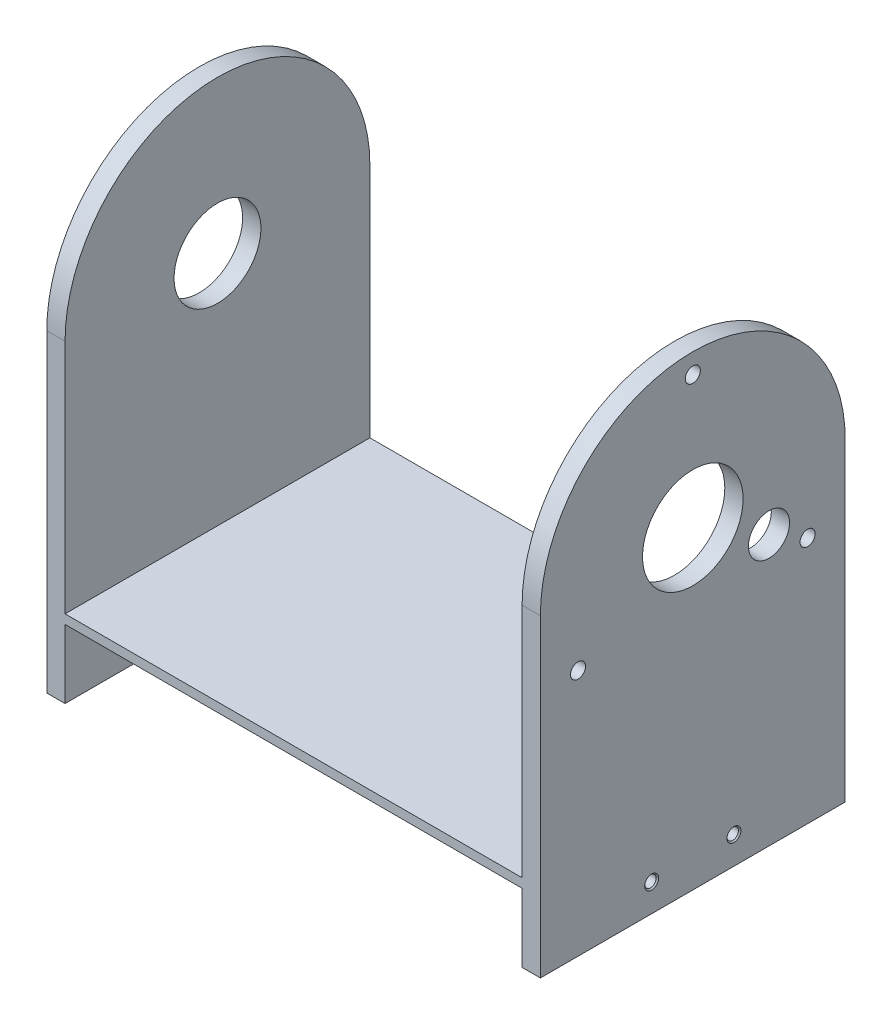
ISO-10303-21;
HEADER;
FILE_DESCRIPTION(('STEP AP214'),'2;1');
FILE_NAME('part.step','',(''),(''),'','','');
FILE_SCHEMA(('AUTOMOTIVE_DESIGN { 1 0 10303 214 1 1 1 1 }'));
ENDSEC;
DATA;
#1=APPLICATION_CONTEXT('core data for automotive mechanical design processes');
#2=APPLICATION_PROTOCOL_DEFINITION('international standard','automotive_design',2000,#1);
#3=PRODUCT_CONTEXT('',#1,'mechanical');
#4=PRODUCT('Part','Part','',(#3));
#5=PRODUCT_RELATED_PRODUCT_CATEGORY('part','',(#4));
#6=PRODUCT_DEFINITION_FORMATION('','',#4);
#7=PRODUCT_DEFINITION_CONTEXT('part definition',#1,'design');
#8=PRODUCT_DEFINITION('design','',#6,#7);
#9=PRODUCT_DEFINITION_SHAPE('','',#8);
#10=(LENGTH_UNIT() NAMED_UNIT(*) SI_UNIT(.MILLI.,.METRE.));
#11=(NAMED_UNIT(*) PLANE_ANGLE_UNIT() SI_UNIT($,.RADIAN.));
#12=(NAMED_UNIT(*) SI_UNIT($,.STERADIAN.) SOLID_ANGLE_UNIT());
#13=UNCERTAINTY_MEASURE_WITH_UNIT(LENGTH_MEASURE(1.E-05),#10,'distance_accuracy_value','');
#14=(GEOMETRIC_REPRESENTATION_CONTEXT(3) GLOBAL_UNCERTAINTY_ASSIGNED_CONTEXT((#13)) GLOBAL_UNIT_ASSIGNED_CONTEXT((#10,
#11,#12)) REPRESENTATION_CONTEXT('',''));
#15=CARTESIAN_POINT('',(0.,0.,0.));
#16=DIRECTION('',(0.,0.,1.));
#17=DIRECTION('',(1.,0.,0.));
#18=AXIS2_PLACEMENT_3D('',#15,#16,#17);
#19=CARTESIAN_POINT('',(-120.,102.,-33.35));
#20=DIRECTION('',(-1.,0.,0.));
#21=DIRECTION('',(0.,0.,1.));
#22=AXIS2_PLACEMENT_3D('',#19,#20,#21);
#23=PLANE('',#22);
#24=CARTESIAN_POINT('',(-120.,68.65,0.));
#25=DIRECTION('',(-1.,0.,0.));
#26=DIRECTION('',(0.,0.,1.));
#27=AXIS2_PLACEMENT_3D('',#24,#25,#26);
#28=CIRCLE('',#27,9.5);
#29=CARTESIAN_POINT('',(-120.,68.65,9.5));
#30=VERTEX_POINT('',#29);
#31=EDGE_CURVE('E251',#30,#30,#28,.F.);
#32=ORIENTED_EDGE('',*,*,#31,.F.);
#33=EDGE_LOOP('',(#32));
#34=FACE_BOUND('',#33,.T.);
#35=CARTESIAN_POINT('',(-120.,68.65,0.));
#36=DIRECTION('',(-1.,0.,0.));
#37=DIRECTION('',(0.,0.,1.));
#38=AXIS2_PLACEMENT_3D('',#35,#36,#37);
#39=CIRCLE('',#38,33.35);
#40=CARTESIAN_POINT('',(-120.,68.65,33.35));
#41=VERTEX_POINT('',#40);
#42=CARTESIAN_POINT('',(-120.,68.65,-33.35));
#43=VERTEX_POINT('',#42);
#44=EDGE_CURVE('E263',#41,#43,#39,.T.);
#45=ORIENTED_EDGE('',*,*,#44,.F.);
#46=DIRECTION('',(0.,-1.,0.));
#47=VECTOR('',#46,1.);
#48=CARTESIAN_POINT('',(-120.,102.,33.35));
#49=LINE('',#48,#47);
#50=CARTESIAN_POINT('',(-120.,17.,33.35));
#51=VERTEX_POINT('',#50);
#52=EDGE_CURVE('E274',#41,#51,#49,.T.);
#53=ORIENTED_EDGE('',*,*,#52,.T.);
#54=DIRECTION('',(0.,0.,1.));
#55=VECTOR('',#54,1.);
#56=CARTESIAN_POINT('',(-120.,17.,-33.35));
#57=LINE('',#56,#55);
#58=CARTESIAN_POINT('',(-120.,17.,-33.35));
#59=VERTEX_POINT('',#58);
#60=EDGE_CURVE('E285',#59,#51,#57,.T.);
#61=ORIENTED_EDGE('',*,*,#60,.F.);
#62=DIRECTION('',(0.,-1.,0.));
#63=VECTOR('',#62,1.);
#64=CARTESIAN_POINT('',(-120.,102.,-33.35));
#65=LINE('',#64,#63);
#66=EDGE_CURVE('E280',#43,#59,#65,.T.);
#67=ORIENTED_EDGE('',*,*,#66,.F.);
#68=EDGE_LOOP('',(#45,#53,#61,#67));
#69=FACE_BOUND('',#68,.T.);
#70=ADVANCED_FACE('F77',(#34,#69),#23,.F.);
#71=CARTESIAN_POINT('',(-124.,102.,-33.35));
#72=DIRECTION('',(1.,0.,0.));
#73=DIRECTION('',(0.,0.,-1.));
#74=AXIS2_PLACEMENT_3D('',#71,#72,#73);
#75=PLANE('',#74);
#76=CARTESIAN_POINT('',(-124.,6.,9.00000000000001));
#77=DIRECTION('',(1.,0.,0.));
#78=DIRECTION('',(0.,0.,-1.));
#79=AXIS2_PLACEMENT_3D('',#76,#77,#78);
#80=CIRCLE('',#79,1.24999999999999);
#81=CARTESIAN_POINT('',(-124.,6.,7.75000000000002));
#82=VERTEX_POINT('',#81);
#83=EDGE_CURVE('E390',#82,#82,#80,.T.);
#84=ORIENTED_EDGE('',*,*,#83,.T.);
#85=EDGE_LOOP('',(#84));
#86=FACE_BOUND('',#85,.T.);
#87=CARTESIAN_POINT('',(-124.,6.,-8.99999999999999));
#88=DIRECTION('',(1.,0.,0.));
#89=DIRECTION('',(0.,0.,-1.));
#90=AXIS2_PLACEMENT_3D('',#87,#88,#89);
#91=CIRCLE('',#90,1.24999999999999);
#92=CARTESIAN_POINT('',(-124.,6.,-10.25));
#93=VERTEX_POINT('',#92);
#94=EDGE_CURVE('E222',#93,#93,#91,.T.);
#95=ORIENTED_EDGE('',*,*,#94,.T.);
#96=EDGE_LOOP('',(#95));
#97=FACE_BOUND('',#96,.T.);
#98=CARTESIAN_POINT('',(-124.,68.65,0.));
#99=DIRECTION('',(-1.,0.,0.));
#100=DIRECTION('',(0.,0.,1.));
#101=AXIS2_PLACEMENT_3D('',#98,#99,#100);
#102=CIRCLE('',#101,9.5);
#103=CARTESIAN_POINT('',(-124.,68.65,9.5));
#104=VERTEX_POINT('',#103);
#105=EDGE_CURVE('E250',#104,#104,#102,.T.);
#106=ORIENTED_EDGE('',*,*,#105,.F.);
#107=EDGE_LOOP('',(#106));
#108=FACE_BOUND('',#107,.T.);
#109=DIRECTION('',(0.,-1.,0.));
#110=VECTOR('',#109,1.);
#111=CARTESIAN_POINT('',(-124.,102.,33.35));
#112=LINE('',#111,#110);
#113=CARTESIAN_POINT('',(-124.,68.65,33.35));
#114=VERTEX_POINT('',#113);
#115=CARTESIAN_POINT('',(-124.,0.,33.35));
#116=VERTEX_POINT('',#115);
#117=EDGE_CURVE('E276',#114,#116,#112,.T.);
#118=ORIENTED_EDGE('',*,*,#117,.F.);
#119=CARTESIAN_POINT('',(-124.,68.65,0.));
#120=DIRECTION('',(1.,0.,0.));
#121=DIRECTION('',(0.,0.,-1.));
#122=AXIS2_PLACEMENT_3D('',#119,#120,#121);
#123=CIRCLE('',#122,33.35);
#124=CARTESIAN_POINT('',(-124.,68.65,-33.35));
#125=VERTEX_POINT('',#124);
#126=EDGE_CURVE('E261',#125,#114,#123,.T.);
#127=ORIENTED_EDGE('',*,*,#126,.F.);
#128=DIRECTION('',(0.,-1.,0.));
#129=VECTOR('',#128,1.);
#130=CARTESIAN_POINT('',(-124.,102.,-33.35));
#131=LINE('',#130,#129);
#132=CARTESIAN_POINT('',(-124.,0.,-33.35));
#133=VERTEX_POINT('',#132);
#134=EDGE_CURVE('E102',#125,#133,#131,.T.);
#135=ORIENTED_EDGE('',*,*,#134,.T.);
#136=DIRECTION('',(0.,0.,-1.));
#137=VECTOR('',#136,1.);
#138=CARTESIAN_POINT('',(-124.,0.,33.35));
#139=LINE('',#138,#137);
#140=EDGE_CURVE('E186',#116,#133,#139,.T.);
#141=ORIENTED_EDGE('',*,*,#140,.F.);
#142=EDGE_LOOP('',(#118,#127,#135,#141));
#143=FACE_BOUND('',#142,.T.);
#144=ADVANCED_FACE('F355',(#86,#97,#108,#143),#75,.F.);
#145=CARTESIAN_POINT('',(-20.,2.,-33.35));
#146=DIRECTION('',(0.,0.,1.));
#147=DIRECTION('',(1.,0.,0.));
#148=AXIS2_PLACEMENT_3D('',#145,#146,#147);
#149=PLANE('',#148);
#150=DIRECTION('',(0.,-1.,0.));
#151=VECTOR('',#150,1.);
#152=CARTESIAN_POINT('',(-16.,102.,-33.35));
#153=LINE('',#152,#151);
#154=CARTESIAN_POINT('',(-16.,68.65,-33.35));
#155=VERTEX_POINT('',#154);
#156=CARTESIAN_POINT('',(-16.,0.,-33.35));
#157=VERTEX_POINT('',#156);
#158=EDGE_CURVE('E171',#155,#157,#153,.T.);
#159=ORIENTED_EDGE('',*,*,#158,.T.);
#160=DIRECTION('',(-1.,0.,0.));
#161=VECTOR('',#160,1.);
#162=CARTESIAN_POINT('',(-20.,0.,-33.35));
#163=LINE('',#162,#161);
#164=CARTESIAN_POINT('',(-20.,0.,-33.35));
#165=VERTEX_POINT('',#164);
#166=EDGE_CURVE('E174',#157,#165,#163,.T.);
#167=ORIENTED_EDGE('',*,*,#166,.T.);
#168=DIRECTION('',(0.,-1.,0.));
#169=VECTOR('',#168,1.);
#170=CARTESIAN_POINT('',(-20.,2.,-33.35));
#171=LINE('',#170,#169);
#172=CARTESIAN_POINT('',(-20.,15.,-33.35));
#173=VERTEX_POINT('',#172);
#174=EDGE_CURVE('E203',#173,#165,#171,.T.);
#175=ORIENTED_EDGE('',*,*,#174,.F.);
#176=DIRECTION('',(1.,0.,0.));
#177=VECTOR('',#176,1.);
#178=CARTESIAN_POINT('',(-120.,15.,-33.35));
#179=LINE('',#178,#177);
#180=CARTESIAN_POINT('',(-120.,15.,-33.35));
#181=VERTEX_POINT('',#180);
#182=EDGE_CURVE('E301',#181,#173,#179,.T.);
#183=ORIENTED_EDGE('',*,*,#182,.F.);
#184=CARTESIAN_POINT('',(-120.,0.,-33.35));
#185=VERTEX_POINT('',#184);
#186=EDGE_CURVE('E279',#181,#185,#65,.T.);
#187=ORIENTED_EDGE('',*,*,#186,.T.);
#188=DIRECTION('',(-1.,0.,0.));
#189=VECTOR('',#188,1.);
#190=CARTESIAN_POINT('',(-120.,0.,-33.35));
#191=LINE('',#190,#189);
#192=EDGE_CURVE('E268',#185,#133,#191,.T.);
#193=ORIENTED_EDGE('',*,*,#192,.T.);
#194=ORIENTED_EDGE('',*,*,#134,.F.);
#195=DIRECTION('',(-1.,0.,0.));
#196=VECTOR('',#195,1.);
#197=CARTESIAN_POINT('',(20.,68.65,-33.35));
#198=LINE('',#197,#196);
#199=EDGE_CURVE('E259',#43,#125,#198,.T.);
#200=ORIENTED_EDGE('',*,*,#199,.F.);
#201=ORIENTED_EDGE('',*,*,#66,.T.);
#202=DIRECTION('',(1.,0.,0.));
#203=VECTOR('',#202,1.);
#204=CARTESIAN_POINT('',(-120.,17.,-33.35));
#205=LINE('',#204,#203);
#206=CARTESIAN_POINT('',(-20.,17.,-33.35));
#207=VERTEX_POINT('',#206);
#208=EDGE_CURVE('E289',#59,#207,#205,.T.);
#209=ORIENTED_EDGE('',*,*,#208,.T.);
#210=CARTESIAN_POINT('',(-20.,68.65,-33.35));
#211=VERTEX_POINT('',#210);
#212=EDGE_CURVE('E86',#211,#207,#171,.T.);
#213=ORIENTED_EDGE('',*,*,#212,.F.);
#214=DIRECTION('',(-1.,0.,0.));
#215=VECTOR('',#214,1.);
#216=CARTESIAN_POINT('',(20.,68.65,-33.35));
#217=LINE('',#216,#215);
#218=EDGE_CURVE('E178',#155,#211,#217,.T.);
#219=ORIENTED_EDGE('',*,*,#218,.F.);
#220=EDGE_LOOP('',(#159,#167,#175,#183,#187,#193,#194,#200,#201,#209,#213,#219));
#221=FACE_BOUND('',#220,.T.);
#222=ADVANCED_FACE('F79',(#221),#149,.F.);
#223=CARTESIAN_POINT('',(-20.,2.,33.35));
#224=DIRECTION('',(1.,0.,0.));
#225=DIRECTION('',(0.,0.,-1.));
#226=AXIS2_PLACEMENT_3D('',#223,#224,#225);
#227=PLANE('',#226);
#228=CARTESIAN_POINT('',(-20.,6.,9.));
#229=DIRECTION('',(1.,0.,0.));
#230=DIRECTION('',(0.,0.,-1.));
#231=AXIS2_PLACEMENT_3D('',#228,#229,#230);
#232=CIRCLE('',#231,1.24999999999999);
#233=CARTESIAN_POINT('',(-20.,6.,7.75000000000001));
#234=VERTEX_POINT('',#233);
#235=EDGE_CURVE('E389',#234,#234,#232,.T.);
#236=ORIENTED_EDGE('',*,*,#235,.T.);
#237=EDGE_LOOP('',(#236));
#238=FACE_BOUND('',#237,.T.);
#239=CARTESIAN_POINT('',(-20.,6.,-9.));
#240=DIRECTION('',(1.,0.,0.));
#241=DIRECTION('',(0.,0.,-1.));
#242=AXIS2_PLACEMENT_3D('',#239,#240,#241);
#243=CIRCLE('',#242,1.24999999999999);
#244=CARTESIAN_POINT('',(-20.,6.,-10.25));
#245=VERTEX_POINT('',#244);
#246=EDGE_CURVE('E187',#245,#245,#243,.T.);
#247=ORIENTED_EDGE('',*,*,#246,.T.);
#248=EDGE_LOOP('',(#247));
#249=FACE_BOUND('',#248,.T.);
#250=DIRECTION('',(0.,0.,1.));
#251=VECTOR('',#250,1.);
#252=CARTESIAN_POINT('',(-20.,15.,-33.35));
#253=LINE('',#252,#251);
#254=CARTESIAN_POINT('',(-20.,15.,33.35));
#255=VERTEX_POINT('',#254);
#256=EDGE_CURVE('E282',#173,#255,#253,.T.);
#257=ORIENTED_EDGE('',*,*,#256,.F.);
#258=ORIENTED_EDGE('',*,*,#174,.T.);
#259=DIRECTION('',(0.,0.,1.));
#260=VECTOR('',#259,1.);
#261=CARTESIAN_POINT('',(-20.,0.,33.35));
#262=LINE('',#261,#260);
#263=CARTESIAN_POINT('',(-20.,0.,33.35));
#264=VERTEX_POINT('',#263);
#265=EDGE_CURVE('E192',#165,#264,#262,.T.);
#266=ORIENTED_EDGE('',*,*,#265,.T.);
#267=DIRECTION('',(0.,-1.,0.));
#268=VECTOR('',#267,1.);
#269=CARTESIAN_POINT('',(-20.,2.,33.35));
#270=LINE('',#269,#268);
#271=EDGE_CURVE('E199',#255,#264,#270,.T.);
#272=ORIENTED_EDGE('',*,*,#271,.F.);
#273=EDGE_LOOP('',(#257,#258,#266,#272));
#274=FACE_BOUND('',#273,.T.);
#275=ADVANCED_FACE('F327',(#238,#249,#274),#227,.F.);
#276=CARTESIAN_POINT('',(-20.,59.0250000000002,-16.6709890228505));
#277=DIRECTION('',(1.,0.,0.));
#278=DIRECTION('',(0.,0.,-1.));
#279=AXIS2_PLACEMENT_3D('',#276,#277,#278);
#280=CIRCLE('',#279,4.49999999999999);
#281=CARTESIAN_POINT('',(-20.,59.0250000000002,-21.1709890228505));
#282=VERTEX_POINT('',#281);
#283=EDGE_CURVE('E238',#282,#282,#280,.F.);
#284=ORIENTED_EDGE('',*,*,#283,.F.);
#285=EDGE_LOOP('',(#284));
#286=FACE_BOUND('',#285,.T.);
#287=CARTESIAN_POINT('',(-20.,68.65,0.));
#288=DIRECTION('',(1.,0.,0.));
#289=DIRECTION('',(0.,0.,-1.));
#290=AXIS2_PLACEMENT_3D('',#287,#288,#289);
#291=CIRCLE('',#290,11.);
#292=CARTESIAN_POINT('',(-20.,68.65,-11.));
#293=VERTEX_POINT('',#292);
#294=EDGE_CURVE('E247',#293,#293,#291,.F.);
#295=ORIENTED_EDGE('',*,*,#294,.F.);
#296=EDGE_LOOP('',(#295));
#297=FACE_BOUND('',#296,.T.);
#298=CARTESIAN_POINT('',(-20.,97.65,0.));
#299=DIRECTION('',(-1.,0.,0.));
#300=DIRECTION('',(0.,0.,1.));
#301=AXIS2_PLACEMENT_3D('',#298,#299,#300);
#302=CIRCLE('',#301,2.025);
#303=CARTESIAN_POINT('',(-20.,97.65,2.025));
#304=VERTEX_POINT('',#303);
#305=EDGE_CURVE('E304',#304,#304,#302,.T.);
#306=ORIENTED_EDGE('',*,*,#305,.F.);
#307=EDGE_LOOP('',(#306));
#308=FACE_BOUND('',#307,.T.);
#309=CARTESIAN_POINT('',(-20.,54.1499999999999,25.1147367097487));
#310=DIRECTION('',(-1.,0.,0.));
#311=DIRECTION('',(0.,0.,1.));
#312=AXIS2_PLACEMENT_3D('',#309,#310,#311);
#313=CIRCLE('',#312,2.025);
#314=CARTESIAN_POINT('',(-20.,54.1499999999999,27.1397367097487));
#315=VERTEX_POINT('',#314);
#316=EDGE_CURVE('E218',#315,#315,#313,.T.);
#317=ORIENTED_EDGE('',*,*,#316,.F.);
#318=EDGE_LOOP('',(#317));
#319=FACE_BOUND('',#318,.T.);
#320=CARTESIAN_POINT('',(-20.,54.1500000000002,-25.1147367097489));
#321=DIRECTION('',(-1.,0.,0.));
#322=DIRECTION('',(0.,0.,1.));
#323=AXIS2_PLACEMENT_3D('',#320,#321,#322);
#324=CIRCLE('',#323,2.025);
#325=CARTESIAN_POINT('',(-20.,54.1500000000002,-23.0897367097489));
#326=VERTEX_POINT('',#325);
#327=EDGE_CURVE('E214',#326,#326,#324,.T.);
#328=ORIENTED_EDGE('',*,*,#327,.F.);
#329=EDGE_LOOP('',(#328));
#330=FACE_BOUND('',#329,.T.);
#331=ORIENTED_EDGE('',*,*,#212,.T.);
#332=DIRECTION('',(0.,0.,1.));
#333=VECTOR('',#332,1.);
#334=CARTESIAN_POINT('',(-20.,17.,-33.35));
#335=LINE('',#334,#333);
#336=CARTESIAN_POINT('',(-20.,17.,33.35));
#337=VERTEX_POINT('',#336);
#338=EDGE_CURVE('E286',#207,#337,#335,.T.);
#339=ORIENTED_EDGE('',*,*,#338,.T.);
#340=CARTESIAN_POINT('',(-20.,68.65,33.35));
#341=VERTEX_POINT('',#340);
#342=EDGE_CURVE('E200',#341,#337,#270,.T.);
#343=ORIENTED_EDGE('',*,*,#342,.F.);
#344=CARTESIAN_POINT('',(-20.,68.65,0.));
#345=DIRECTION('',(-1.,0.,0.));
#346=DIRECTION('',(0.,0.,1.));
#347=AXIS2_PLACEMENT_3D('',#344,#345,#346);
#348=CIRCLE('',#347,33.35);
#349=EDGE_CURVE('E179',#341,#211,#348,.T.);
#350=ORIENTED_EDGE('',*,*,#349,.T.);
#351=EDGE_LOOP('',(#331,#339,#343,#350));
#352=FACE_BOUND('',#351,.T.);
#353=ADVANCED_FACE('F354',(#286,#297,#308,#319,#330,#352),#227,.F.);
#354=CARTESIAN_POINT('',(-16.,102.,-33.35));
#355=DIRECTION('',(-1.,0.,0.));
#356=DIRECTION('',(0.,0.,1.));
#357=AXIS2_PLACEMENT_3D('',#354,#355,#356);
#358=PLANE('',#357);
#359=CARTESIAN_POINT('',(-16.,6.,9.));
#360=DIRECTION('',(1.,0.,0.));
#361=DIRECTION('',(0.,0.,-1.));
#362=AXIS2_PLACEMENT_3D('',#359,#360,#361);
#363=CIRCLE('',#362,1.525);
#364=CARTESIAN_POINT('',(-16.,6.,7.475));
#365=VERTEX_POINT('',#364);
#366=EDGE_CURVE('E398',#365,#365,#363,.T.);
#367=ORIENTED_EDGE('',*,*,#366,.F.);
#368=EDGE_LOOP('',(#367));
#369=FACE_BOUND('',#368,.T.);
#370=CARTESIAN_POINT('',(-16.,6.,-9.));
#371=DIRECTION('',(1.,0.,0.));
#372=DIRECTION('',(0.,0.,-1.));
#373=AXIS2_PLACEMENT_3D('',#370,#371,#372);
#374=CIRCLE('',#373,1.525);
#375=CARTESIAN_POINT('',(-16.,6.,-10.525));
#376=VERTEX_POINT('',#375);
#377=EDGE_CURVE('E233',#376,#376,#374,.T.);
#378=ORIENTED_EDGE('',*,*,#377,.F.);
#379=EDGE_LOOP('',(#378));
#380=FACE_BOUND('',#379,.T.);
#381=CARTESIAN_POINT('',(-16.,59.0250000000002,-16.6709890228505));
#382=DIRECTION('',(1.,0.,0.));
#383=DIRECTION('',(0.,0.,-1.));
#384=AXIS2_PLACEMENT_3D('',#381,#382,#383);
#385=CIRCLE('',#384,4.49999999999999);
#386=CARTESIAN_POINT('',(-16.,59.0250000000002,-21.1709890228505));
#387=VERTEX_POINT('',#386);
#388=EDGE_CURVE('E241',#387,#387,#385,.T.);
#389=ORIENTED_EDGE('',*,*,#388,.F.);
#390=EDGE_LOOP('',(#389));
#391=FACE_BOUND('',#390,.T.);
#392=CARTESIAN_POINT('',(-16.,68.65,0.));
#393=DIRECTION('',(1.,0.,0.));
#394=DIRECTION('',(0.,0.,-1.));
#395=AXIS2_PLACEMENT_3D('',#392,#393,#394);
#396=CIRCLE('',#395,11.);
#397=CARTESIAN_POINT('',(-16.,68.65,-11.));
#398=VERTEX_POINT('',#397);
#399=EDGE_CURVE('E244',#398,#398,#396,.T.);
#400=ORIENTED_EDGE('',*,*,#399,.F.);
#401=EDGE_LOOP('',(#400));
#402=FACE_BOUND('',#401,.T.);
#403=CARTESIAN_POINT('',(-16.,97.65,0.));
#404=DIRECTION('',(-1.,0.,0.));
#405=DIRECTION('',(0.,0.,1.));
#406=AXIS2_PLACEMENT_3D('',#403,#404,#405);
#407=CIRCLE('',#406,1.64999999999998);
#408=CARTESIAN_POINT('',(-16.,97.65,1.64999999999998));
#409=VERTEX_POINT('',#408);
#410=EDGE_CURVE('E216',#409,#409,#407,.T.);
#411=ORIENTED_EDGE('',*,*,#410,.T.);
#412=EDGE_LOOP('',(#411));
#413=FACE_BOUND('',#412,.T.);
#414=CARTESIAN_POINT('',(-16.,54.1499999999999,25.1147367097487));
#415=DIRECTION('',(-1.,0.,0.));
#416=DIRECTION('',(0.,0.,1.));
#417=AXIS2_PLACEMENT_3D('',#414,#415,#416);
#418=CIRCLE('',#417,1.64999999999999);
#419=CARTESIAN_POINT('',(-16.,54.1499999999999,26.7647367097487));
#420=VERTEX_POINT('',#419);
#421=EDGE_CURVE('E211',#420,#420,#418,.T.);
#422=ORIENTED_EDGE('',*,*,#421,.T.);
#423=EDGE_LOOP('',(#422));
#424=FACE_BOUND('',#423,.T.);
#425=CARTESIAN_POINT('',(-16.,54.1500000000002,-25.1147367097489));
#426=DIRECTION('',(-1.,0.,0.));
#427=DIRECTION('',(0.,0.,1.));
#428=AXIS2_PLACEMENT_3D('',#425,#426,#427);
#429=CIRCLE('',#428,1.64999999999999);
#430=CARTESIAN_POINT('',(-16.,54.1500000000002,-23.4647367097489));
#431=VERTEX_POINT('',#430);
#432=EDGE_CURVE('E207',#431,#431,#429,.T.);
#433=ORIENTED_EDGE('',*,*,#432,.T.);
#434=EDGE_LOOP('',(#433));
#435=FACE_BOUND('',#434,.T.);
#436=CARTESIAN_POINT('',(-16.,68.65,0.));
#437=DIRECTION('',(-1.,0.,0.));
#438=DIRECTION('',(0.,0.,1.));
#439=AXIS2_PLACEMENT_3D('',#436,#437,#438);
#440=CIRCLE('',#439,33.35);
#441=CARTESIAN_POINT('',(-16.,68.65,33.35));
#442=VERTEX_POINT('',#441);
#443=EDGE_CURVE('E206',#442,#155,#440,.T.);
#444=ORIENTED_EDGE('',*,*,#443,.F.);
#445=DIRECTION('',(0.,-1.,0.));
#446=VECTOR('',#445,1.);
#447=CARTESIAN_POINT('',(-16.,102.,33.35));
#448=LINE('',#447,#446);
#449=CARTESIAN_POINT('',(-16.,0.,33.35));
#450=VERTEX_POINT('',#449);
#451=EDGE_CURVE('E94',#442,#450,#448,.T.);
#452=ORIENTED_EDGE('',*,*,#451,.T.);
#453=DIRECTION('',(0.,0.,1.));
#454=VECTOR('',#453,1.);
#455=CARTESIAN_POINT('',(-16.,0.,33.35));
#456=LINE('',#455,#454);
#457=EDGE_CURVE('E181',#157,#450,#456,.T.);
#458=ORIENTED_EDGE('',*,*,#457,.F.);
#459=ORIENTED_EDGE('',*,*,#158,.F.);
#460=EDGE_LOOP('',(#444,#452,#458,#459));
#461=FACE_BOUND('',#460,.T.);
#462=ADVANCED_FACE('F182',(#369,#380,#391,#402,#413,#424,#435,#461),#358,.F.);
#463=CARTESIAN_POINT('',(-20.,2.,33.35));
#464=DIRECTION('',(0.,0.,-1.));
#465=DIRECTION('',(-1.,0.,0.));
#466=AXIS2_PLACEMENT_3D('',#463,#464,#465);
#467=PLANE('',#466);
#468=DIRECTION('',(1.,0.,0.));
#469=VECTOR('',#468,1.);
#470=CARTESIAN_POINT('',(-20.,0.,33.35));
#471=LINE('',#470,#469);
#472=EDGE_CURVE('E194',#264,#450,#471,.T.);
#473=ORIENTED_EDGE('',*,*,#472,.T.);
#474=ORIENTED_EDGE('',*,*,#451,.F.);
#475=DIRECTION('',(-1.,0.,0.));
#476=VECTOR('',#475,1.);
#477=CARTESIAN_POINT('',(20.,68.65,33.35));
#478=LINE('',#477,#476);
#479=EDGE_CURVE('E12',#442,#341,#478,.T.);
#480=ORIENTED_EDGE('',*,*,#479,.T.);
#481=ORIENTED_EDGE('',*,*,#342,.T.);
#482=DIRECTION('',(1.,0.,0.));
#483=VECTOR('',#482,1.);
#484=CARTESIAN_POINT('',(-120.,17.,33.35));
#485=LINE('',#484,#483);
#486=EDGE_CURVE('E295',#51,#337,#485,.T.);
#487=ORIENTED_EDGE('',*,*,#486,.F.);
#488=ORIENTED_EDGE('',*,*,#52,.F.);
#489=DIRECTION('',(-1.,0.,0.));
#490=VECTOR('',#489,1.);
#491=CARTESIAN_POINT('',(20.,68.65,33.35));
#492=LINE('',#491,#490);
#493=EDGE_CURVE('E254',#41,#114,#492,.T.);
#494=ORIENTED_EDGE('',*,*,#493,.T.);
#495=ORIENTED_EDGE('',*,*,#117,.T.);
#496=DIRECTION('',(1.,0.,0.));
#497=VECTOR('',#496,1.);
#498=CARTESIAN_POINT('',(-120.,0.,33.35));
#499=LINE('',#498,#497);
#500=CARTESIAN_POINT('',(-120.,0.,33.35));
#501=VERTEX_POINT('',#500);
#502=EDGE_CURVE('E271',#116,#501,#499,.T.);
#503=ORIENTED_EDGE('',*,*,#502,.T.);
#504=CARTESIAN_POINT('',(-120.,15.,33.35));
#505=VERTEX_POINT('',#504);
#506=EDGE_CURVE('E273',#505,#501,#49,.T.);
#507=ORIENTED_EDGE('',*,*,#506,.F.);
#508=DIRECTION('',(1.,0.,0.));
#509=VECTOR('',#508,1.);
#510=CARTESIAN_POINT('',(-120.,15.,33.35));
#511=LINE('',#510,#509);
#512=EDGE_CURVE('E298',#505,#255,#511,.T.);
#513=ORIENTED_EDGE('',*,*,#512,.T.);
#514=ORIENTED_EDGE('',*,*,#271,.T.);
#515=EDGE_LOOP('',(#473,#474,#480,#481,#487,#488,#494,#495,#503,#507,#513,#514));
#516=FACE_BOUND('',#515,.T.);
#517=ADVANCED_FACE('F323',(#516),#467,.F.);
#518=CARTESIAN_POINT('',(0.,0.,0.));
#519=DIRECTION('',(0.,-1.,0.));
#520=DIRECTION('',(0.,0.,-1.));
#521=AXIS2_PLACEMENT_3D('',#518,#519,#520);
#522=PLANE('',#521);
#523=ORIENTED_EDGE('',*,*,#457,.T.);
#524=ORIENTED_EDGE('',*,*,#472,.F.);
#525=ORIENTED_EDGE('',*,*,#265,.F.);
#526=ORIENTED_EDGE('',*,*,#166,.F.);
#527=EDGE_LOOP('',(#523,#524,#525,#526));
#528=FACE_BOUND('',#527,.T.);
#529=ADVANCED_FACE('F190',(#528),#522,.T.);
#530=CARTESIAN_POINT('',(20.,68.65,0.));
#531=DIRECTION('',(-1.,0.,0.));
#532=DIRECTION('',(0.,0.,1.));
#533=AXIS2_PLACEMENT_3D('',#530,#531,#532);
#534=CYLINDRICAL_SURFACE('',#533,33.35);
#535=ORIENTED_EDGE('',*,*,#443,.T.);
#536=ORIENTED_EDGE('',*,*,#218,.T.);
#537=ORIENTED_EDGE('',*,*,#349,.F.);
#538=ORIENTED_EDGE('',*,*,#479,.F.);
#539=EDGE_LOOP('',(#535,#536,#537,#538));
#540=FACE_BOUND('',#539,.T.);
#541=ADVANCED_FACE('F320',(#540),#534,.T.);
#542=CARTESIAN_POINT('',(-20.,54.1500000000002,-25.1147367097489));
#543=DIRECTION('',(-1.,0.,0.));
#544=DIRECTION('',(0.,0.,1.));
#545=AXIS2_PLACEMENT_3D('',#542,#543,#544);
#546=CYLINDRICAL_SURFACE('',#545,1.64999999999999);
#547=CARTESIAN_POINT('',(-19.625,54.1500000000002,-25.1147367097489));
#548=DIRECTION('',(-1.,0.,0.));
#549=DIRECTION('',(0.,0.,1.));
#550=AXIS2_PLACEMENT_3D('',#547,#548,#549);
#551=CIRCLE('',#550,1.64999999999999);
#552=CARTESIAN_POINT('',(-19.625,54.1500000000002,-23.4647367097489));
#553=VERTEX_POINT('',#552);
#554=EDGE_CURVE('E210',#553,#553,#551,.T.);
#555=ORIENTED_EDGE('',*,*,#554,.T.);
#556=EDGE_LOOP('',(#555));
#557=FACE_BOUND('',#556,.T.);
#558=ORIENTED_EDGE('',*,*,#432,.F.);
#559=EDGE_LOOP('',(#558));
#560=FACE_BOUND('',#559,.T.);
#561=ADVANCED_FACE('F419',(#557,#560),#546,.F.);
#562=CARTESIAN_POINT('',(-20.,54.1500000000002,-25.1147367097489));
#563=DIRECTION('',(-1.,0.,0.));
#564=DIRECTION('',(0.,0.,1.));
#565=AXIS2_PLACEMENT_3D('',#562,#563,#564);
#566=CONICAL_SURFACE('',#565,2.025,0.785398163397458);
#567=ORIENTED_EDGE('',*,*,#554,.F.);
#568=EDGE_LOOP('',(#567));
#569=FACE_BOUND('',#568,.T.);
#570=ORIENTED_EDGE('',*,*,#327,.T.);
#571=EDGE_LOOP('',(#570));
#572=FACE_BOUND('',#571,.T.);
#573=ADVANCED_FACE('F421',(#569,#572),#566,.F.);
#574=CARTESIAN_POINT('',(-20.,54.1499999999999,25.1147367097487));
#575=DIRECTION('',(-1.,0.,0.));
#576=DIRECTION('',(0.,0.,1.));
#577=AXIS2_PLACEMENT_3D('',#574,#575,#576);
#578=CYLINDRICAL_SURFACE('',#577,1.64999999999999);
#579=CARTESIAN_POINT('',(-19.625,54.1499999999999,25.1147367097487));
#580=DIRECTION('',(-1.,0.,0.));
#581=DIRECTION('',(0.,0.,1.));
#582=AXIS2_PLACEMENT_3D('',#579,#580,#581);
#583=CIRCLE('',#582,1.64999999999999);
#584=CARTESIAN_POINT('',(-19.625,54.1499999999999,26.7647367097487));
#585=VERTEX_POINT('',#584);
#586=EDGE_CURVE('E215',#585,#585,#583,.T.);
#587=ORIENTED_EDGE('',*,*,#586,.T.);
#588=EDGE_LOOP('',(#587));
#589=FACE_BOUND('',#588,.T.);
#590=ORIENTED_EDGE('',*,*,#421,.F.);
#591=EDGE_LOOP('',(#590));
#592=FACE_BOUND('',#591,.T.);
#593=ADVANCED_FACE('F427',(#589,#592),#578,.F.);
#594=CARTESIAN_POINT('',(-20.,54.1499999999999,25.1147367097487));
#595=DIRECTION('',(-1.,0.,0.));
#596=DIRECTION('',(0.,0.,1.));
#597=AXIS2_PLACEMENT_3D('',#594,#595,#596);
#598=CONICAL_SURFACE('',#597,2.025,0.785398163397458);
#599=ORIENTED_EDGE('',*,*,#586,.F.);
#600=EDGE_LOOP('',(#599));
#601=FACE_BOUND('',#600,.T.);
#602=ORIENTED_EDGE('',*,*,#316,.T.);
#603=EDGE_LOOP('',(#602));
#604=FACE_BOUND('',#603,.T.);
#605=ADVANCED_FACE('F455',(#601,#604),#598,.F.);
#606=CARTESIAN_POINT('',(-20.,97.65,0.));
#607=DIRECTION('',(-1.,0.,0.));
#608=DIRECTION('',(0.,0.,1.));
#609=AXIS2_PLACEMENT_3D('',#606,#607,#608);
#610=CYLINDRICAL_SURFACE('',#609,1.64999999999998);
#611=CARTESIAN_POINT('',(-19.625,97.65,0.));
#612=DIRECTION('',(-1.,0.,0.));
#613=DIRECTION('',(0.,0.,1.));
#614=AXIS2_PLACEMENT_3D('',#611,#612,#613);
#615=CIRCLE('',#614,1.64999999999998);
#616=CARTESIAN_POINT('',(-19.625,97.65,1.64999999999998));
#617=VERTEX_POINT('',#616);
#618=EDGE_CURVE('E219',#617,#617,#615,.T.);
#619=ORIENTED_EDGE('',*,*,#618,.T.);
#620=EDGE_LOOP('',(#619));
#621=FACE_BOUND('',#620,.T.);
#622=ORIENTED_EDGE('',*,*,#410,.F.);
#623=EDGE_LOOP('',(#622));
#624=FACE_BOUND('',#623,.T.);
#625=ADVANCED_FACE('F457',(#621,#624),#610,.F.);
#626=CARTESIAN_POINT('',(-20.,97.65,0.));
#627=DIRECTION('',(-1.,0.,0.));
#628=DIRECTION('',(0.,0.,1.));
#629=AXIS2_PLACEMENT_3D('',#626,#627,#628);
#630=CONICAL_SURFACE('',#629,2.025,0.785398163397467);
#631=ORIENTED_EDGE('',*,*,#618,.F.);
#632=EDGE_LOOP('',(#631));
#633=FACE_BOUND('',#632,.T.);
#634=ORIENTED_EDGE('',*,*,#305,.T.);
#635=EDGE_LOOP('',(#634));
#636=FACE_BOUND('',#635,.T.);
#637=ADVANCED_FACE('F464',(#633,#636),#630,.F.);
#638=CARTESIAN_POINT('',(-120.,15.,-33.35));
#639=DIRECTION('',(0.,1.,0.));
#640=DIRECTION('',(0.,0.,1.));
#641=AXIS2_PLACEMENT_3D('',#638,#639,#640);
#642=PLANE('',#641);
#643=ORIENTED_EDGE('',*,*,#256,.T.);
#644=ORIENTED_EDGE('',*,*,#512,.F.);
#645=DIRECTION('',(0.,0.,1.));
#646=VECTOR('',#645,1.);
#647=CARTESIAN_POINT('',(-120.,15.,-33.35));
#648=LINE('',#647,#646);
#649=EDGE_CURVE('E283',#181,#505,#648,.T.);
#650=ORIENTED_EDGE('',*,*,#649,.F.);
#651=ORIENTED_EDGE('',*,*,#182,.T.);
#652=EDGE_LOOP('',(#643,#644,#650,#651));
#653=FACE_BOUND('',#652,.T.);
#654=ADVANCED_FACE('F331',(#653),#642,.F.);
#655=CARTESIAN_POINT('',(-120.,17.,-33.35));
#656=DIRECTION('',(0.,1.,0.));
#657=DIRECTION('',(0.,0.,1.));
#658=AXIS2_PLACEMENT_3D('',#655,#656,#657);
#659=PLANE('',#658);
#660=ORIENTED_EDGE('',*,*,#338,.F.);
#661=ORIENTED_EDGE('',*,*,#208,.F.);
#662=ORIENTED_EDGE('',*,*,#60,.T.);
#663=ORIENTED_EDGE('',*,*,#486,.T.);
#664=EDGE_LOOP('',(#660,#661,#662,#663));
#665=FACE_BOUND('',#664,.T.);
#666=ADVANCED_FACE('F352',(#665),#659,.T.);
#667=CARTESIAN_POINT('',(-120.,6.,9.00000000000001));
#668=DIRECTION('',(-1.,0.,0.));
#669=DIRECTION('',(0.,0.,1.));
#670=AXIS2_PLACEMENT_3D('',#667,#668,#669);
#671=CIRCLE('',#670,1.24999999999999);
#672=CARTESIAN_POINT('',(-120.,6.,10.25));
#673=VERTEX_POINT('',#672);
#674=EDGE_CURVE('E81',#673,#673,#671,.T.);
#675=ORIENTED_EDGE('',*,*,#674,.T.);
#676=EDGE_LOOP('',(#675));
#677=FACE_BOUND('',#676,.T.);
#678=CARTESIAN_POINT('',(-120.,6.,-8.99999999999999));
#679=DIRECTION('',(-1.,0.,0.));
#680=DIRECTION('',(0.,0.,1.));
#681=AXIS2_PLACEMENT_3D('',#678,#679,#680);
#682=CIRCLE('',#681,1.24999999999999);
#683=CARTESIAN_POINT('',(-120.,6.,-7.75));
#684=VERTEX_POINT('',#683);
#685=EDGE_CURVE('E220',#684,#684,#682,.T.);
#686=ORIENTED_EDGE('',*,*,#685,.T.);
#687=EDGE_LOOP('',(#686));
#688=FACE_BOUND('',#687,.T.);
#689=ORIENTED_EDGE('',*,*,#186,.F.);
#690=ORIENTED_EDGE('',*,*,#649,.T.);
#691=ORIENTED_EDGE('',*,*,#506,.T.);
#692=DIRECTION('',(0.,0.,-1.));
#693=VECTOR('',#692,1.);
#694=CARTESIAN_POINT('',(-120.,0.,-33.35));
#695=LINE('',#694,#693);
#696=EDGE_CURVE('E265',#501,#185,#695,.T.);
#697=ORIENTED_EDGE('',*,*,#696,.T.);
#698=EDGE_LOOP('',(#689,#690,#691,#697));
#699=FACE_BOUND('',#698,.T.);
#700=ADVANCED_FACE('F334',(#677,#688,#699),#23,.F.);
#701=CARTESIAN_POINT('',(0.,0.,0.));
#702=DIRECTION('',(0.,-1.,0.));
#703=DIRECTION('',(0.,0.,-1.));
#704=AXIS2_PLACEMENT_3D('',#701,#702,#703);
#705=PLANE('',#704);
#706=ORIENTED_EDGE('',*,*,#140,.T.);
#707=ORIENTED_EDGE('',*,*,#192,.F.);
#708=ORIENTED_EDGE('',*,*,#696,.F.);
#709=ORIENTED_EDGE('',*,*,#502,.F.);
#710=EDGE_LOOP('',(#706,#707,#708,#709));
#711=FACE_BOUND('',#710,.T.);
#712=ADVANCED_FACE('F339',(#711),#705,.T.);
#713=CARTESIAN_POINT('',(20.,68.65,0.));
#714=DIRECTION('',(-1.,0.,0.));
#715=DIRECTION('',(0.,0.,1.));
#716=AXIS2_PLACEMENT_3D('',#713,#714,#715);
#717=CYLINDRICAL_SURFACE('',#716,33.35);
#718=ORIENTED_EDGE('',*,*,#44,.T.);
#719=ORIENTED_EDGE('',*,*,#199,.T.);
#720=ORIENTED_EDGE('',*,*,#126,.T.);
#721=ORIENTED_EDGE('',*,*,#493,.F.);
#722=EDGE_LOOP('',(#718,#719,#720,#721));
#723=FACE_BOUND('',#722,.T.);
#724=ADVANCED_FACE('F356',(#723),#717,.T.);
#725=CARTESIAN_POINT('',(20.001,68.65,0.));
#726=DIRECTION('',(-1.,0.,0.));
#727=DIRECTION('',(0.,0.,1.));
#728=AXIS2_PLACEMENT_3D('',#725,#726,#727);
#729=CYLINDRICAL_SURFACE('',#728,9.5);
#730=ORIENTED_EDGE('',*,*,#105,.T.);
#731=EDGE_LOOP('',(#730));
#732=FACE_BOUND('',#731,.T.);
#733=ORIENTED_EDGE('',*,*,#31,.T.);
#734=EDGE_LOOP('',(#733));
#735=FACE_BOUND('',#734,.T.);
#736=ADVANCED_FACE('F358',(#732,#735),#729,.F.);
#737=CARTESIAN_POINT('',(-160.001,68.65,0.));
#738=DIRECTION('',(1.,0.,0.));
#739=DIRECTION('',(0.,0.,-1.));
#740=AXIS2_PLACEMENT_3D('',#737,#738,#739);
#741=CYLINDRICAL_SURFACE('',#740,11.);
#742=ORIENTED_EDGE('',*,*,#399,.T.);
#743=EDGE_LOOP('',(#742));
#744=FACE_BOUND('',#743,.T.);
#745=ORIENTED_EDGE('',*,*,#294,.T.);
#746=EDGE_LOOP('',(#745));
#747=FACE_BOUND('',#746,.T.);
#748=ADVANCED_FACE('F365',(#744,#747),#741,.F.);
#749=CARTESIAN_POINT('',(-160.001,59.0250000000002,-16.6709890228505));
#750=DIRECTION('',(1.,0.,0.));
#751=DIRECTION('',(0.,0.,-1.));
#752=AXIS2_PLACEMENT_3D('',#749,#750,#751);
#753=CYLINDRICAL_SURFACE('',#752,4.49999999999999);
#754=ORIENTED_EDGE('',*,*,#388,.T.);
#755=EDGE_LOOP('',(#754));
#756=FACE_BOUND('',#755,.T.);
#757=ORIENTED_EDGE('',*,*,#283,.T.);
#758=EDGE_LOOP('',(#757));
#759=FACE_BOUND('',#758,.T.);
#760=ADVANCED_FACE('F607',(#756,#759),#753,.F.);
#761=CARTESIAN_POINT('',(-16.,6.,-9.));
#762=DIRECTION('',(1.,0.,0.));
#763=DIRECTION('',(0.,0.,-1.));
#764=AXIS2_PLACEMENT_3D('',#761,#762,#763);
#765=CONICAL_SURFACE('',#764,1.525,0.785398163397445);
#766=CARTESIAN_POINT('',(-16.275,6.,-9.));
#767=DIRECTION('',(1.,0.,0.));
#768=DIRECTION('',(0.,0.,-1.));
#769=AXIS2_PLACEMENT_3D('',#766,#767,#768);
#770=CIRCLE('',#769,1.24999999999999);
#771=CARTESIAN_POINT('',(-16.275,6.,-10.25));
#772=VERTEX_POINT('',#771);
#773=EDGE_CURVE('E228',#772,#772,#770,.T.);
#774=ORIENTED_EDGE('',*,*,#773,.F.);
#775=EDGE_LOOP('',(#774));
#776=FACE_BOUND('',#775,.T.);
#777=ORIENTED_EDGE('',*,*,#377,.T.);
#778=EDGE_LOOP('',(#777));
#779=FACE_BOUND('',#778,.T.);
#780=ADVANCED_FACE('F404',(#776,#779),#765,.F.);
#781=CARTESIAN_POINT('',(-16.,6.,-9.));
#782=DIRECTION('',(1.,0.,0.));
#783=DIRECTION('',(0.,0.,-1.));
#784=AXIS2_PLACEMENT_3D('',#781,#782,#783);
#785=CYLINDRICAL_SURFACE('',#784,1.24999999999999);
#786=ORIENTED_EDGE('',*,*,#773,.T.);
#787=EDGE_LOOP('',(#786));
#788=FACE_BOUND('',#787,.T.);
#789=ORIENTED_EDGE('',*,*,#246,.F.);
#790=EDGE_LOOP('',(#789));
#791=FACE_BOUND('',#790,.T.);
#792=ADVANCED_FACE('F641',(#788,#791),#785,.F.);
#793=ORIENTED_EDGE('',*,*,#94,.F.);
#794=EDGE_LOOP('',(#793));
#795=FACE_BOUND('',#794,.T.);
#796=ORIENTED_EDGE('',*,*,#685,.F.);
#797=EDGE_LOOP('',(#796));
#798=FACE_BOUND('',#797,.T.);
#799=ADVANCED_FACE('F652',(#795,#798),#785,.F.);
#800=CARTESIAN_POINT('',(-16.,6.,9.));
#801=DIRECTION('',(1.,0.,0.));
#802=DIRECTION('',(0.,0.,-1.));
#803=AXIS2_PLACEMENT_3D('',#800,#801,#802);
#804=CYLINDRICAL_SURFACE('',#803,1.24999999999999);
#805=ORIENTED_EDGE('',*,*,#83,.F.);
#806=EDGE_LOOP('',(#805));
#807=FACE_BOUND('',#806,.T.);
#808=ORIENTED_EDGE('',*,*,#674,.F.);
#809=EDGE_LOOP('',(#808));
#810=FACE_BOUND('',#809,.T.);
#811=ADVANCED_FACE('F663',(#807,#810),#804,.F.);
#812=CARTESIAN_POINT('',(-16.275,6.,9.));
#813=DIRECTION('',(1.,0.,0.));
#814=DIRECTION('',(0.,0.,-1.));
#815=AXIS2_PLACEMENT_3D('',#812,#813,#814);
#816=CIRCLE('',#815,1.24999999999999);
#817=CARTESIAN_POINT('',(-16.275,6.,7.75000000000001));
#818=VERTEX_POINT('',#817);
#819=EDGE_CURVE('E394',#818,#818,#816,.T.);
#820=ORIENTED_EDGE('',*,*,#819,.T.);
#821=EDGE_LOOP('',(#820));
#822=FACE_BOUND('',#821,.T.);
#823=ORIENTED_EDGE('',*,*,#235,.F.);
#824=EDGE_LOOP('',(#823));
#825=FACE_BOUND('',#824,.T.);
#826=ADVANCED_FACE('F673',(#822,#825),#804,.F.);
#827=CARTESIAN_POINT('',(-16.,6.,9.));
#828=DIRECTION('',(1.,0.,0.));
#829=DIRECTION('',(0.,0.,-1.));
#830=AXIS2_PLACEMENT_3D('',#827,#828,#829);
#831=CONICAL_SURFACE('',#830,1.525,0.785398163397445);
#832=ORIENTED_EDGE('',*,*,#819,.F.);
#833=EDGE_LOOP('',(#832));
#834=FACE_BOUND('',#833,.T.);
#835=ORIENTED_EDGE('',*,*,#366,.T.);
#836=EDGE_LOOP('',(#835));
#837=FACE_BOUND('',#836,.T.);
#838=ADVANCED_FACE('F684',(#834,#837),#831,.F.);
#839=CLOSED_SHELL('',(#70,#144,#222,#275,#353,#462,#517,#529,#541,#561,#573,#593,#605,#625,#637,
#654,#666,#700,#712,#724,#736,#748,#760,#780,#792,#799,#811,#826,#838));
#840=MANIFOLD_SOLID_BREP('B2',#839);
#841=ADVANCED_BREP_SHAPE_REPRESENTATION('',(#18,#840),#14);
#842=SHAPE_DEFINITION_REPRESENTATION(#9,#841);
ENDSEC;
END-ISO-10303-21;
